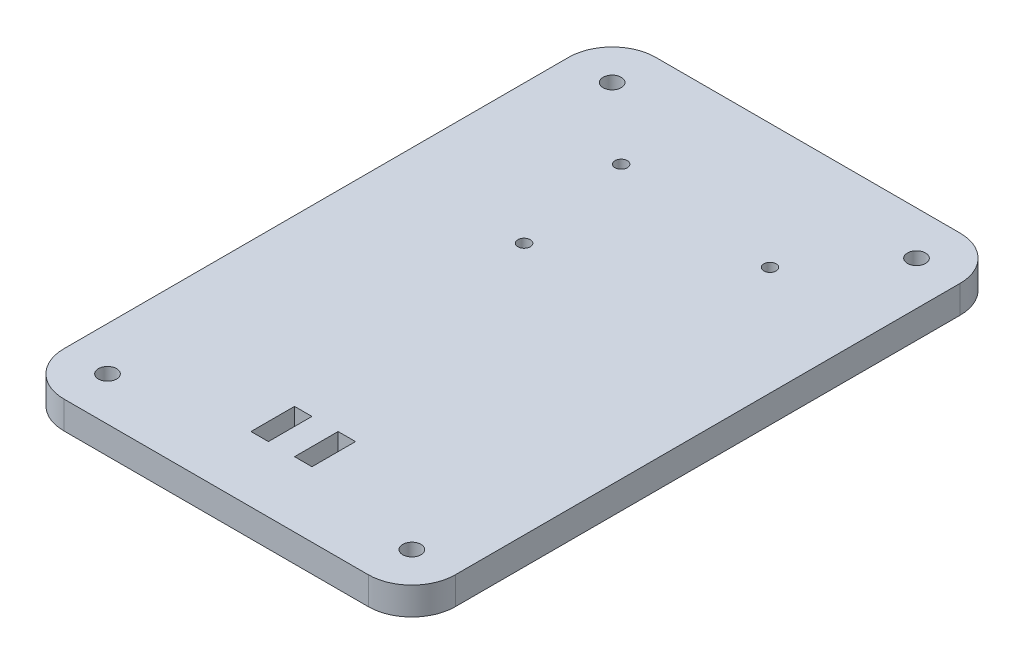
ISO-10303-21;
HEADER;
FILE_DESCRIPTION(('STEP AP214'),'2;1');
FILE_NAME('part.step','',(''),(''),'','','');
FILE_SCHEMA(('AUTOMOTIVE_DESIGN { 1 0 10303 214 1 1 1 1 }'));
ENDSEC;
DATA;
#1=APPLICATION_CONTEXT('core data for automotive mechanical design processes');
#2=APPLICATION_PROTOCOL_DEFINITION('international standard','automotive_design',2000,#1);
#3=PRODUCT_CONTEXT('',#1,'mechanical');
#4=PRODUCT('Part','Part','',(#3));
#5=PRODUCT_RELATED_PRODUCT_CATEGORY('part','',(#4));
#6=PRODUCT_DEFINITION_FORMATION('','',#4);
#7=PRODUCT_DEFINITION_CONTEXT('part definition',#1,'design');
#8=PRODUCT_DEFINITION('design','',#6,#7);
#9=PRODUCT_DEFINITION_SHAPE('','',#8);
#10=(LENGTH_UNIT() NAMED_UNIT(*) SI_UNIT(.MILLI.,.METRE.));
#11=(NAMED_UNIT(*) PLANE_ANGLE_UNIT() SI_UNIT($,.RADIAN.));
#12=(NAMED_UNIT(*) SI_UNIT($,.STERADIAN.) SOLID_ANGLE_UNIT());
#13=UNCERTAINTY_MEASURE_WITH_UNIT(LENGTH_MEASURE(1.E-05),#10,'distance_accuracy_value','');
#14=(GEOMETRIC_REPRESENTATION_CONTEXT(3) GLOBAL_UNCERTAINTY_ASSIGNED_CONTEXT((#13)) GLOBAL_UNIT_ASSIGNED_CONTEXT((#10,
#11,#12)) REPRESENTATION_CONTEXT('',''));
#15=CARTESIAN_POINT('',(0.,0.,0.));
#16=DIRECTION('',(0.,0.,1.));
#17=DIRECTION('',(1.,0.,0.));
#18=AXIS2_PLACEMENT_3D('',#15,#16,#17);
#19=CARTESIAN_POINT('',(34.925,6.35,-57.912));
#20=DIRECTION('',(0.,-1.,0.));
#21=DIRECTION('',(0.,0.,-1.));
#22=AXIS2_PLACEMENT_3D('',#19,#20,#21);
#23=PLANE('',#22);
#24=DIRECTION('',(0.,0.,-1.));
#25=VECTOR('',#24,1.);
#26=CARTESIAN_POINT('',(-3.,6.35,42.912));
#27=LINE('',#26,#25);
#28=CARTESIAN_POINT('',(-3.,6.35,52.912));
#29=VERTEX_POINT('',#28);
#30=CARTESIAN_POINT('',(-3.,6.35,42.912));
#31=VERTEX_POINT('',#30);
#32=EDGE_CURVE('E182',#29,#31,#27,.T.);
#33=ORIENTED_EDGE('',*,*,#32,.F.);
#34=DIRECTION('',(1.,0.,0.));
#35=VECTOR('',#34,1.);
#36=CARTESIAN_POINT('',(-7.,6.35,52.912));
#37=LINE('',#36,#35);
#38=CARTESIAN_POINT('',(-7.,6.35,52.912));
#39=VERTEX_POINT('',#38);
#40=EDGE_CURVE('E190',#39,#29,#37,.T.);
#41=ORIENTED_EDGE('',*,*,#40,.F.);
#42=DIRECTION('',(0.,0.,1.));
#43=VECTOR('',#42,1.);
#44=CARTESIAN_POINT('',(-7.,6.35,42.912));
#45=LINE('',#44,#43);
#46=CARTESIAN_POINT('',(-7.,6.35,42.912));
#47=VERTEX_POINT('',#46);
#48=EDGE_CURVE('E187',#47,#39,#45,.T.);
#49=ORIENTED_EDGE('',*,*,#48,.F.);
#50=DIRECTION('',(-1.,0.,0.));
#51=VECTOR('',#50,1.);
#52=CARTESIAN_POINT('',(-7.,6.35,42.912));
#53=LINE('',#52,#51);
#54=EDGE_CURVE('E184',#31,#47,#53,.T.);
#55=ORIENTED_EDGE('',*,*,#54,.F.);
#56=EDGE_LOOP('',(#33,#41,#49,#55));
#57=FACE_BOUND('',#56,.T.);
#58=CARTESIAN_POINT('',(-13.081,6.35,-15.8572));
#59=DIRECTION('',(0.,1.,0.));
#60=DIRECTION('',(0.,0.,1.));
#61=AXIS2_PLACEMENT_3D('',#58,#59,#60);
#62=CIRCLE('',#61,1.42240000000003);
#63=CARTESIAN_POINT('',(-13.081,6.35,-14.4348));
#64=VERTEX_POINT('',#63);
#65=EDGE_CURVE('E219',#64,#64,#62,.T.);
#66=ORIENTED_EDGE('',*,*,#65,.F.);
#67=EDGE_LOOP('',(#66));
#68=FACE_BOUND('',#67,.T.);
#69=CARTESIAN_POINT('',(-34.925,6.35,57.912));
#70=DIRECTION('',(0.,1.,0.));
#71=DIRECTION('',(0.,0.,1.));
#72=AXIS2_PLACEMENT_3D('',#69,#70,#71);
#73=CIRCLE('',#72,2.0828);
#74=CARTESIAN_POINT('',(-34.925,6.35,59.9948));
#75=VERTEX_POINT('',#74);
#76=EDGE_CURVE('E231',#75,#75,#73,.T.);
#77=ORIENTED_EDGE('',*,*,#76,.F.);
#78=EDGE_LOOP('',(#77));
#79=FACE_BOUND('',#78,.T.);
#80=CARTESIAN_POINT('',(34.925,6.35,-57.912));
#81=DIRECTION('',(0.,1.,0.));
#82=DIRECTION('',(0.,0.,1.));
#83=AXIS2_PLACEMENT_3D('',#80,#81,#82);
#84=CIRCLE('',#83,2.0828);
#85=CARTESIAN_POINT('',(34.925,6.35,-55.8292));
#86=VERTEX_POINT('',#85);
#87=EDGE_CURVE('E243',#86,#86,#84,.T.);
#88=ORIENTED_EDGE('',*,*,#87,.F.);
#89=EDGE_LOOP('',(#88));
#90=FACE_BOUND('',#89,.T.);
#91=CARTESIAN_POINT('',(34.925,6.35,-57.912));
#92=DIRECTION('',(0.,1.,0.));
#93=DIRECTION('',(0.,0.,-1.));
#94=AXIS2_PLACEMENT_3D('',#91,#92,#93);
#95=CIRCLE('',#94,10.);
#96=CARTESIAN_POINT('',(44.925,6.35,-57.912));
#97=VERTEX_POINT('',#96);
#98=CARTESIAN_POINT('',(34.925,6.35,-67.912));
#99=VERTEX_POINT('',#98);
#100=EDGE_CURVE('E255',#97,#99,#95,.T.);
#101=ORIENTED_EDGE('',*,*,#100,.T.);
#102=DIRECTION('',(-1.,0.,0.));
#103=VECTOR('',#102,1.);
#104=CARTESIAN_POINT('',(-34.925,6.35,-67.912));
#105=LINE('',#104,#103);
#106=CARTESIAN_POINT('',(-34.925,6.35,-67.912));
#107=VERTEX_POINT('',#106);
#108=EDGE_CURVE('E258',#99,#107,#105,.T.);
#109=ORIENTED_EDGE('',*,*,#108,.T.);
#110=CARTESIAN_POINT('',(-34.925,6.35,-57.912));
#111=DIRECTION('',(0.,1.,0.));
#112=DIRECTION('',(0.,0.,1.));
#113=AXIS2_PLACEMENT_3D('',#110,#111,#112);
#114=CIRCLE('',#113,10.);
#115=CARTESIAN_POINT('',(-44.925,6.35,-57.912));
#116=VERTEX_POINT('',#115);
#117=EDGE_CURVE('E261',#107,#116,#114,.T.);
#118=ORIENTED_EDGE('',*,*,#117,.T.);
#119=DIRECTION('',(0.,0.,1.));
#120=VECTOR('',#119,1.);
#121=CARTESIAN_POINT('',(-44.925,6.35,57.912));
#122=LINE('',#121,#120);
#123=CARTESIAN_POINT('',(-44.925,6.35,57.912));
#124=VERTEX_POINT('',#123);
#125=EDGE_CURVE('E263',#116,#124,#122,.T.);
#126=ORIENTED_EDGE('',*,*,#125,.T.);
#127=CARTESIAN_POINT('',(-34.925,6.35,57.912));
#128=DIRECTION('',(0.,1.,0.));
#129=DIRECTION('',(0.,0.,-1.));
#130=AXIS2_PLACEMENT_3D('',#127,#128,#129);
#131=CIRCLE('',#130,10.);
#132=CARTESIAN_POINT('',(-34.925,6.35,67.912));
#133=VERTEX_POINT('',#132);
#134=EDGE_CURVE('E265',#124,#133,#131,.T.);
#135=ORIENTED_EDGE('',*,*,#134,.T.);
#136=DIRECTION('',(1.,0.,0.));
#137=VECTOR('',#136,1.);
#138=CARTESIAN_POINT('',(-34.925,6.35,67.912));
#139=LINE('',#138,#137);
#140=CARTESIAN_POINT('',(34.925,6.35,67.912));
#141=VERTEX_POINT('',#140);
#142=EDGE_CURVE('E267',#133,#141,#139,.T.);
#143=ORIENTED_EDGE('',*,*,#142,.T.);
#144=CARTESIAN_POINT('',(34.925,6.35,57.912));
#145=DIRECTION('',(0.,1.,0.));
#146=DIRECTION('',(0.,0.,-1.));
#147=AXIS2_PLACEMENT_3D('',#144,#145,#146);
#148=CIRCLE('',#147,10.);
#149=CARTESIAN_POINT('',(44.925,6.35,57.912));
#150=VERTEX_POINT('',#149);
#151=EDGE_CURVE('E269',#141,#150,#148,.T.);
#152=ORIENTED_EDGE('',*,*,#151,.T.);
#153=DIRECTION('',(0.,0.,-1.));
#154=VECTOR('',#153,1.);
#155=CARTESIAN_POINT('',(44.925,6.35,57.912));
#156=LINE('',#155,#154);
#157=EDGE_CURVE('E271',#150,#97,#156,.T.);
#158=ORIENTED_EDGE('',*,*,#157,.T.);
#159=EDGE_LOOP('',(#101,#109,#118,#126,#135,#143,#152,#158));
#160=FACE_BOUND('',#159,.T.);
#161=CARTESIAN_POINT('',(-34.925,6.35,-57.912));
#162=DIRECTION('',(0.,1.,0.));
#163=DIRECTION('',(0.,0.,1.));
#164=AXIS2_PLACEMENT_3D('',#161,#162,#163);
#165=CIRCLE('',#164,2.0828);
#166=CARTESIAN_POINT('',(-34.925,6.35,-55.8292));
#167=VERTEX_POINT('',#166);
#168=EDGE_CURVE('E249',#167,#167,#165,.T.);
#169=ORIENTED_EDGE('',*,*,#168,.F.);
#170=EDGE_LOOP('',(#169));
#171=FACE_BOUND('',#170,.T.);
#172=CARTESIAN_POINT('',(34.925,6.35,57.912));
#173=DIRECTION('',(0.,1.,0.));
#174=DIRECTION('',(0.,0.,1.));
#175=AXIS2_PLACEMENT_3D('',#172,#173,#174);
#176=CIRCLE('',#175,2.0828);
#177=CARTESIAN_POINT('',(34.925,6.35,59.9948));
#178=VERTEX_POINT('',#177);
#179=EDGE_CURVE('E237',#178,#178,#176,.T.);
#180=ORIENTED_EDGE('',*,*,#179,.F.);
#181=EDGE_LOOP('',(#180));
#182=FACE_BOUND('',#181,.T.);
#183=CARTESIAN_POINT('',(19.939,6.35,-39.276));
#184=DIRECTION('',(0.,1.,0.));
#185=DIRECTION('',(0.,0.,1.));
#186=AXIS2_PLACEMENT_3D('',#183,#184,#185);
#187=CIRCLE('',#186,1.42240000000003);
#188=CARTESIAN_POINT('',(19.939,6.35,-37.8536));
#189=VERTEX_POINT('',#188);
#190=EDGE_CURVE('E225',#189,#189,#187,.T.);
#191=ORIENTED_EDGE('',*,*,#190,.F.);
#192=EDGE_LOOP('',(#191));
#193=FACE_BOUND('',#192,.T.);
#194=CARTESIAN_POINT('',(-17.653,6.35,-42.705));
#195=DIRECTION('',(0.,1.,0.));
#196=DIRECTION('',(0.,0.,1.));
#197=AXIS2_PLACEMENT_3D('',#194,#195,#196);
#198=CIRCLE('',#197,1.42239999999999);
#199=CARTESIAN_POINT('',(-17.653,6.35,-41.2826));
#200=VERTEX_POINT('',#199);
#201=EDGE_CURVE('E213',#200,#200,#198,.T.);
#202=ORIENTED_EDGE('',*,*,#201,.F.);
#203=EDGE_LOOP('',(#202));
#204=FACE_BOUND('',#203,.T.);
#205=DIRECTION('',(0.,0.,-1.));
#206=VECTOR('',#205,1.);
#207=CARTESIAN_POINT('',(7.00000000000001,6.35,52.912));
#208=LINE('',#207,#206);
#209=CARTESIAN_POINT('',(7.00000000000001,6.35,52.912));
#210=VERTEX_POINT('',#209);
#211=CARTESIAN_POINT('',(7.,6.35,42.912));
#212=VERTEX_POINT('',#211);
#213=EDGE_CURVE('E146',#210,#212,#208,.T.);
#214=ORIENTED_EDGE('',*,*,#213,.F.);
#215=DIRECTION('',(1.,0.,0.));
#216=VECTOR('',#215,1.);
#217=CARTESIAN_POINT('',(3.,6.35,52.912));
#218=LINE('',#217,#216);
#219=CARTESIAN_POINT('',(3.,6.35,52.912));
#220=VERTEX_POINT('',#219);
#221=EDGE_CURVE('E168',#220,#210,#218,.T.);
#222=ORIENTED_EDGE('',*,*,#221,.F.);
#223=DIRECTION('',(0.,0.,1.));
#224=VECTOR('',#223,1.);
#225=CARTESIAN_POINT('',(3.,6.35,52.912));
#226=LINE('',#225,#224);
#227=CARTESIAN_POINT('',(3.,6.35,42.912));
#228=VERTEX_POINT('',#227);
#229=EDGE_CURVE('E166',#228,#220,#226,.T.);
#230=ORIENTED_EDGE('',*,*,#229,.F.);
#231=DIRECTION('',(-1.,0.,0.));
#232=VECTOR('',#231,1.);
#233=CARTESIAN_POINT('',(3.,6.35,42.912));
#234=LINE('',#233,#232);
#235=EDGE_CURVE('E154',#212,#228,#234,.T.);
#236=ORIENTED_EDGE('',*,*,#235,.F.);
#237=EDGE_LOOP('',(#214,#222,#230,#236));
#238=FACE_BOUND('',#237,.T.);
#239=ADVANCED_FACE('F33',(#57,#68,#79,#90,#160,#171,#182,#193,#204,#238),#23,.F.);
#240=CARTESIAN_POINT('',(34.925,0.,-57.912));
#241=DIRECTION('',(0.,-1.,0.));
#242=DIRECTION('',(0.,0.,-1.));
#243=AXIS2_PLACEMENT_3D('',#240,#241,#242);
#244=PLANE('',#243);
#245=DIRECTION('',(1.,0.,0.));
#246=VECTOR('',#245,1.);
#247=CARTESIAN_POINT('',(-7.,0.,52.912));
#248=LINE('',#247,#246);
#249=CARTESIAN_POINT('',(-7.,0.,52.912));
#250=VERTEX_POINT('',#249);
#251=CARTESIAN_POINT('',(-3.,0.,52.912));
#252=VERTEX_POINT('',#251);
#253=EDGE_CURVE('E185',#250,#252,#248,.T.);
#254=ORIENTED_EDGE('',*,*,#253,.T.);
#255=DIRECTION('',(0.,0.,-1.));
#256=VECTOR('',#255,1.);
#257=CARTESIAN_POINT('',(-3.,0.,42.912));
#258=LINE('',#257,#256);
#259=CARTESIAN_POINT('',(-3.,0.,42.912));
#260=VERTEX_POINT('',#259);
#261=EDGE_CURVE('E162',#252,#260,#258,.T.);
#262=ORIENTED_EDGE('',*,*,#261,.T.);
#263=DIRECTION('',(-1.,0.,0.));
#264=VECTOR('',#263,1.);
#265=CARTESIAN_POINT('',(-7.,0.,42.912));
#266=LINE('',#265,#264);
#267=CARTESIAN_POINT('',(-7.,0.,42.912));
#268=VERTEX_POINT('',#267);
#269=EDGE_CURVE('E195',#260,#268,#266,.T.);
#270=ORIENTED_EDGE('',*,*,#269,.T.);
#271=DIRECTION('',(0.,0.,1.));
#272=VECTOR('',#271,1.);
#273=CARTESIAN_POINT('',(-7.,0.,42.912));
#274=LINE('',#273,#272);
#275=EDGE_CURVE('E198',#268,#250,#274,.T.);
#276=ORIENTED_EDGE('',*,*,#275,.T.);
#277=EDGE_LOOP('',(#254,#262,#270,#276));
#278=FACE_BOUND('',#277,.T.);
#279=CARTESIAN_POINT('',(-13.081,0.,-15.8572));
#280=DIRECTION('',(0.,1.,0.));
#281=DIRECTION('',(0.,0.,1.));
#282=AXIS2_PLACEMENT_3D('',#279,#280,#281);
#283=CIRCLE('',#282,1.42240000000003);
#284=CARTESIAN_POINT('',(-13.081,0.,-14.4348));
#285=VERTEX_POINT('',#284);
#286=EDGE_CURVE('E216',#285,#285,#283,.T.);
#287=ORIENTED_EDGE('',*,*,#286,.T.);
#288=EDGE_LOOP('',(#287));
#289=FACE_BOUND('',#288,.T.);
#290=CARTESIAN_POINT('',(-34.925,0.,57.912));
#291=DIRECTION('',(0.,1.,0.));
#292=DIRECTION('',(0.,0.,1.));
#293=AXIS2_PLACEMENT_3D('',#290,#291,#292);
#294=CIRCLE('',#293,2.0828);
#295=CARTESIAN_POINT('',(-34.925,0.,59.9948));
#296=VERTEX_POINT('',#295);
#297=EDGE_CURVE('E228',#296,#296,#294,.T.);
#298=ORIENTED_EDGE('',*,*,#297,.T.);
#299=EDGE_LOOP('',(#298));
#300=FACE_BOUND('',#299,.T.);
#301=CARTESIAN_POINT('',(34.925,0.,-57.912));
#302=DIRECTION('',(0.,1.,0.));
#303=DIRECTION('',(0.,0.,1.));
#304=AXIS2_PLACEMENT_3D('',#301,#302,#303);
#305=CIRCLE('',#304,2.0828);
#306=CARTESIAN_POINT('',(34.925,0.,-55.8292));
#307=VERTEX_POINT('',#306);
#308=EDGE_CURVE('E240',#307,#307,#305,.T.);
#309=ORIENTED_EDGE('',*,*,#308,.T.);
#310=EDGE_LOOP('',(#309));
#311=FACE_BOUND('',#310,.T.);
#312=CARTESIAN_POINT('',(34.925,0.,-57.912));
#313=DIRECTION('',(0.,1.,0.));
#314=DIRECTION('',(0.,0.,-1.));
#315=AXIS2_PLACEMENT_3D('',#312,#313,#314);
#316=CIRCLE('',#315,10.);
#317=CARTESIAN_POINT('',(44.925,0.,-57.912));
#318=VERTEX_POINT('',#317);
#319=CARTESIAN_POINT('',(34.925,0.,-67.912));
#320=VERTEX_POINT('',#319);
#321=EDGE_CURVE('E252',#318,#320,#316,.T.);
#322=ORIENTED_EDGE('',*,*,#321,.F.);
#323=DIRECTION('',(0.,0.,-1.));
#324=VECTOR('',#323,1.);
#325=CARTESIAN_POINT('',(44.925,0.,57.912));
#326=LINE('',#325,#324);
#327=CARTESIAN_POINT('',(44.925,0.,57.912));
#328=VERTEX_POINT('',#327);
#329=EDGE_CURVE('E259',#328,#318,#326,.T.);
#330=ORIENTED_EDGE('',*,*,#329,.F.);
#331=CARTESIAN_POINT('',(34.925,0.,57.912));
#332=DIRECTION('',(0.,1.,0.));
#333=DIRECTION('',(0.,0.,-1.));
#334=AXIS2_PLACEMENT_3D('',#331,#332,#333);
#335=CIRCLE('',#334,10.);
#336=CARTESIAN_POINT('',(34.925,0.,67.912));
#337=VERTEX_POINT('',#336);
#338=EDGE_CURVE('E286',#337,#328,#335,.T.);
#339=ORIENTED_EDGE('',*,*,#338,.F.);
#340=DIRECTION('',(1.,0.,0.));
#341=VECTOR('',#340,1.);
#342=CARTESIAN_POINT('',(-34.925,0.,67.912));
#343=LINE('',#342,#341);
#344=CARTESIAN_POINT('',(-34.925,0.,67.912));
#345=VERTEX_POINT('',#344);
#346=EDGE_CURVE('E284',#345,#337,#343,.T.);
#347=ORIENTED_EDGE('',*,*,#346,.F.);
#348=CARTESIAN_POINT('',(-34.925,0.,57.912));
#349=DIRECTION('',(0.,1.,0.));
#350=DIRECTION('',(0.,0.,-1.));
#351=AXIS2_PLACEMENT_3D('',#348,#349,#350);
#352=CIRCLE('',#351,10.);
#353=CARTESIAN_POINT('',(-44.925,0.,57.912));
#354=VERTEX_POINT('',#353);
#355=EDGE_CURVE('E282',#354,#345,#352,.T.);
#356=ORIENTED_EDGE('',*,*,#355,.F.);
#357=DIRECTION('',(0.,0.,1.));
#358=VECTOR('',#357,1.);
#359=CARTESIAN_POINT('',(-44.925,0.,57.912));
#360=LINE('',#359,#358);
#361=CARTESIAN_POINT('',(-44.925,0.,-57.912));
#362=VERTEX_POINT('',#361);
#363=EDGE_CURVE('E280',#362,#354,#360,.T.);
#364=ORIENTED_EDGE('',*,*,#363,.F.);
#365=CARTESIAN_POINT('',(-34.925,0.,-57.912));
#366=DIRECTION('',(0.,1.,0.));
#367=DIRECTION('',(0.,0.,1.));
#368=AXIS2_PLACEMENT_3D('',#365,#366,#367);
#369=CIRCLE('',#368,10.);
#370=CARTESIAN_POINT('',(-34.925,0.,-67.912));
#371=VERTEX_POINT('',#370);
#372=EDGE_CURVE('E278',#371,#362,#369,.T.);
#373=ORIENTED_EDGE('',*,*,#372,.F.);
#374=DIRECTION('',(-1.,0.,0.));
#375=VECTOR('',#374,1.);
#376=CARTESIAN_POINT('',(-34.925,0.,-67.912));
#377=LINE('',#376,#375);
#378=EDGE_CURVE('E276',#320,#371,#377,.T.);
#379=ORIENTED_EDGE('',*,*,#378,.F.);
#380=EDGE_LOOP('',(#322,#330,#339,#347,#356,#364,#373,#379));
#381=FACE_BOUND('',#380,.T.);
#382=CARTESIAN_POINT('',(-34.925,0.,-57.912));
#383=DIRECTION('',(0.,1.,0.));
#384=DIRECTION('',(0.,0.,1.));
#385=AXIS2_PLACEMENT_3D('',#382,#383,#384);
#386=CIRCLE('',#385,2.0828);
#387=CARTESIAN_POINT('',(-34.925,0.,-55.8292));
#388=VERTEX_POINT('',#387);
#389=EDGE_CURVE('E246',#388,#388,#386,.T.);
#390=ORIENTED_EDGE('',*,*,#389,.T.);
#391=EDGE_LOOP('',(#390));
#392=FACE_BOUND('',#391,.T.);
#393=CARTESIAN_POINT('',(34.925,0.,57.912));
#394=DIRECTION('',(0.,1.,0.));
#395=DIRECTION('',(0.,0.,1.));
#396=AXIS2_PLACEMENT_3D('',#393,#394,#395);
#397=CIRCLE('',#396,2.0828);
#398=CARTESIAN_POINT('',(34.925,0.,59.9948));
#399=VERTEX_POINT('',#398);
#400=EDGE_CURVE('E234',#399,#399,#397,.T.);
#401=ORIENTED_EDGE('',*,*,#400,.T.);
#402=EDGE_LOOP('',(#401));
#403=FACE_BOUND('',#402,.T.);
#404=CARTESIAN_POINT('',(19.939,0.,-39.276));
#405=DIRECTION('',(0.,1.,0.));
#406=DIRECTION('',(0.,0.,1.));
#407=AXIS2_PLACEMENT_3D('',#404,#405,#406);
#408=CIRCLE('',#407,1.42240000000003);
#409=CARTESIAN_POINT('',(19.939,0.,-37.8536));
#410=VERTEX_POINT('',#409);
#411=EDGE_CURVE('E222',#410,#410,#408,.T.);
#412=ORIENTED_EDGE('',*,*,#411,.T.);
#413=EDGE_LOOP('',(#412));
#414=FACE_BOUND('',#413,.T.);
#415=CARTESIAN_POINT('',(-17.653,0.,-42.705));
#416=DIRECTION('',(0.,1.,0.));
#417=DIRECTION('',(0.,0.,1.));
#418=AXIS2_PLACEMENT_3D('',#415,#416,#417);
#419=CIRCLE('',#418,1.42239999999999);
#420=CARTESIAN_POINT('',(-17.653,0.,-41.2826));
#421=VERTEX_POINT('',#420);
#422=EDGE_CURVE('E212',#421,#421,#419,.T.);
#423=ORIENTED_EDGE('',*,*,#422,.T.);
#424=EDGE_LOOP('',(#423));
#425=FACE_BOUND('',#424,.T.);
#426=DIRECTION('',(1.,0.,0.));
#427=VECTOR('',#426,1.);
#428=CARTESIAN_POINT('',(3.,0.,52.912));
#429=LINE('',#428,#427);
#430=CARTESIAN_POINT('',(3.,0.,52.912));
#431=VERTEX_POINT('',#430);
#432=CARTESIAN_POINT('',(7.,0.,52.912));
#433=VERTEX_POINT('',#432);
#434=EDGE_CURVE('E155',#431,#433,#429,.T.);
#435=ORIENTED_EDGE('',*,*,#434,.T.);
#436=DIRECTION('',(0.,0.,-1.));
#437=VECTOR('',#436,1.);
#438=CARTESIAN_POINT('',(7.00000000000001,0.,52.912));
#439=LINE('',#438,#437);
#440=CARTESIAN_POINT('',(7.,0.,42.912));
#441=VERTEX_POINT('',#440);
#442=EDGE_CURVE('E56',#433,#441,#439,.T.);
#443=ORIENTED_EDGE('',*,*,#442,.T.);
#444=DIRECTION('',(-1.,0.,0.));
#445=VECTOR('',#444,1.);
#446=CARTESIAN_POINT('',(3.,0.,42.912));
#447=LINE('',#446,#445);
#448=CARTESIAN_POINT('',(3.,0.,42.912));
#449=VERTEX_POINT('',#448);
#450=EDGE_CURVE('E161',#441,#449,#447,.T.);
#451=ORIENTED_EDGE('',*,*,#450,.T.);
#452=DIRECTION('',(0.,0.,1.));
#453=VECTOR('',#452,1.);
#454=CARTESIAN_POINT('',(3.,0.,52.912));
#455=LINE('',#454,#453);
#456=EDGE_CURVE('E174',#449,#431,#455,.T.);
#457=ORIENTED_EDGE('',*,*,#456,.T.);
#458=EDGE_LOOP('',(#435,#443,#451,#457));
#459=FACE_BOUND('',#458,.T.);
#460=ADVANCED_FACE('F316',(#278,#289,#300,#311,#381,#392,#403,#414,#425,#459),#244,.T.);
#461=CARTESIAN_POINT('',(34.925,6.35,-57.912));
#462=DIRECTION('',(0.,-1.,0.));
#463=DIRECTION('',(0.,0.,-1.));
#464=AXIS2_PLACEMENT_3D('',#461,#462,#463);
#465=CYLINDRICAL_SURFACE('',#464,10.);
#466=ORIENTED_EDGE('',*,*,#321,.T.);
#467=DIRECTION('',(0.,-1.,0.));
#468=VECTOR('',#467,1.);
#469=CARTESIAN_POINT('',(34.925,6.35,-67.912));
#470=LINE('',#469,#468);
#471=EDGE_CURVE('E11',#99,#320,#470,.T.);
#472=ORIENTED_EDGE('',*,*,#471,.F.);
#473=ORIENTED_EDGE('',*,*,#100,.F.);
#474=DIRECTION('',(0.,-1.,0.));
#475=VECTOR('',#474,1.);
#476=CARTESIAN_POINT('',(44.925,6.35,-57.912));
#477=LINE('',#476,#475);
#478=EDGE_CURVE('E273',#97,#318,#477,.T.);
#479=ORIENTED_EDGE('',*,*,#478,.T.);
#480=EDGE_LOOP('',(#466,#472,#473,#479));
#481=FACE_BOUND('',#480,.T.);
#482=ADVANCED_FACE('F35',(#481),#465,.T.);
#483=CARTESIAN_POINT('',(-34.925,6.35,-67.912));
#484=DIRECTION('',(0.,0.,1.));
#485=DIRECTION('',(1.,0.,0.));
#486=AXIS2_PLACEMENT_3D('',#483,#484,#485);
#487=PLANE('',#486);
#488=ORIENTED_EDGE('',*,*,#378,.T.);
#489=DIRECTION('',(0.,-1.,0.));
#490=VECTOR('',#489,1.);
#491=CARTESIAN_POINT('',(-34.925,6.35,-67.912));
#492=LINE('',#491,#490);
#493=EDGE_CURVE('E41',#107,#371,#492,.T.);
#494=ORIENTED_EDGE('',*,*,#493,.F.);
#495=ORIENTED_EDGE('',*,*,#108,.F.);
#496=ORIENTED_EDGE('',*,*,#471,.T.);
#497=EDGE_LOOP('',(#488,#494,#495,#496));
#498=FACE_BOUND('',#497,.T.);
#499=ADVANCED_FACE('F334',(#498),#487,.F.);
#500=CARTESIAN_POINT('',(-34.925,6.35,-57.912));
#501=DIRECTION('',(0.,-1.,0.));
#502=DIRECTION('',(0.,0.,-1.));
#503=AXIS2_PLACEMENT_3D('',#500,#501,#502);
#504=CYLINDRICAL_SURFACE('',#503,10.);
#505=ORIENTED_EDGE('',*,*,#372,.T.);
#506=DIRECTION('',(0.,-1.,0.));
#507=VECTOR('',#506,1.);
#508=CARTESIAN_POINT('',(-44.925,6.35,-57.912));
#509=LINE('',#508,#507);
#510=EDGE_CURVE('E303',#116,#362,#509,.T.);
#511=ORIENTED_EDGE('',*,*,#510,.F.);
#512=ORIENTED_EDGE('',*,*,#117,.F.);
#513=ORIENTED_EDGE('',*,*,#493,.T.);
#514=EDGE_LOOP('',(#505,#511,#512,#513));
#515=FACE_BOUND('',#514,.T.);
#516=ADVANCED_FACE('F310',(#515),#504,.T.);
#517=CARTESIAN_POINT('',(-44.925,6.35,57.912));
#518=DIRECTION('',(1.,0.,0.));
#519=DIRECTION('',(0.,0.,-1.));
#520=AXIS2_PLACEMENT_3D('',#517,#518,#519);
#521=PLANE('',#520);
#522=ORIENTED_EDGE('',*,*,#363,.T.);
#523=DIRECTION('',(0.,-1.,0.));
#524=VECTOR('',#523,1.);
#525=CARTESIAN_POINT('',(-44.925,6.35,57.912));
#526=LINE('',#525,#524);
#527=EDGE_CURVE('E300',#124,#354,#526,.T.);
#528=ORIENTED_EDGE('',*,*,#527,.F.);
#529=ORIENTED_EDGE('',*,*,#125,.F.);
#530=ORIENTED_EDGE('',*,*,#510,.T.);
#531=EDGE_LOOP('',(#522,#528,#529,#530));
#532=FACE_BOUND('',#531,.T.);
#533=ADVANCED_FACE('F322',(#532),#521,.F.);
#534=CARTESIAN_POINT('',(-34.925,6.35,57.912));
#535=DIRECTION('',(0.,-1.,0.));
#536=DIRECTION('',(0.,0.,-1.));
#537=AXIS2_PLACEMENT_3D('',#534,#535,#536);
#538=CYLINDRICAL_SURFACE('',#537,10.);
#539=ORIENTED_EDGE('',*,*,#355,.T.);
#540=DIRECTION('',(0.,-1.,0.));
#541=VECTOR('',#540,1.);
#542=CARTESIAN_POINT('',(-34.925,6.35,67.912));
#543=LINE('',#542,#541);
#544=EDGE_CURVE('E297',#133,#345,#543,.T.);
#545=ORIENTED_EDGE('',*,*,#544,.F.);
#546=ORIENTED_EDGE('',*,*,#134,.F.);
#547=ORIENTED_EDGE('',*,*,#527,.T.);
#548=EDGE_LOOP('',(#539,#545,#546,#547));
#549=FACE_BOUND('',#548,.T.);
#550=ADVANCED_FACE('F326',(#549),#538,.T.);
#551=CARTESIAN_POINT('',(-34.925,6.35,67.912));
#552=DIRECTION('',(0.,0.,-1.));
#553=DIRECTION('',(-1.,0.,0.));
#554=AXIS2_PLACEMENT_3D('',#551,#552,#553);
#555=PLANE('',#554);
#556=ORIENTED_EDGE('',*,*,#346,.T.);
#557=DIRECTION('',(0.,-1.,0.));
#558=VECTOR('',#557,1.);
#559=CARTESIAN_POINT('',(34.925,6.35,67.912));
#560=LINE('',#559,#558);
#561=EDGE_CURVE('E294',#141,#337,#560,.T.);
#562=ORIENTED_EDGE('',*,*,#561,.F.);
#563=ORIENTED_EDGE('',*,*,#142,.F.);
#564=ORIENTED_EDGE('',*,*,#544,.T.);
#565=EDGE_LOOP('',(#556,#562,#563,#564));
#566=FACE_BOUND('',#565,.T.);
#567=ADVANCED_FACE('F347',(#566),#555,.F.);
#568=CARTESIAN_POINT('',(34.925,6.35,57.912));
#569=DIRECTION('',(0.,-1.,0.));
#570=DIRECTION('',(0.,0.,-1.));
#571=AXIS2_PLACEMENT_3D('',#568,#569,#570);
#572=CYLINDRICAL_SURFACE('',#571,10.);
#573=ORIENTED_EDGE('',*,*,#338,.T.);
#574=DIRECTION('',(0.,-1.,0.));
#575=VECTOR('',#574,1.);
#576=CARTESIAN_POINT('',(44.925,6.35,57.912));
#577=LINE('',#576,#575);
#578=EDGE_CURVE('E291',#150,#328,#577,.T.);
#579=ORIENTED_EDGE('',*,*,#578,.F.);
#580=ORIENTED_EDGE('',*,*,#151,.F.);
#581=ORIENTED_EDGE('',*,*,#561,.T.);
#582=EDGE_LOOP('',(#573,#579,#580,#581));
#583=FACE_BOUND('',#582,.T.);
#584=ADVANCED_FACE('F345',(#583),#572,.T.);
#585=CARTESIAN_POINT('',(44.925,6.35,57.912));
#586=DIRECTION('',(-1.,0.,0.));
#587=DIRECTION('',(0.,0.,1.));
#588=AXIS2_PLACEMENT_3D('',#585,#586,#587);
#589=PLANE('',#588);
#590=ORIENTED_EDGE('',*,*,#329,.T.);
#591=ORIENTED_EDGE('',*,*,#478,.F.);
#592=ORIENTED_EDGE('',*,*,#157,.F.);
#593=ORIENTED_EDGE('',*,*,#578,.T.);
#594=EDGE_LOOP('',(#590,#591,#592,#593));
#595=FACE_BOUND('',#594,.T.);
#596=ADVANCED_FACE('F340',(#595),#589,.F.);
#597=CARTESIAN_POINT('',(-34.925,6.35,-57.912));
#598=DIRECTION('',(0.,-1.,0.));
#599=DIRECTION('',(0.,0.,-1.));
#600=AXIS2_PLACEMENT_3D('',#597,#598,#599);
#601=CYLINDRICAL_SURFACE('',#600,2.0828);
#602=ORIENTED_EDGE('',*,*,#168,.T.);
#603=EDGE_LOOP('',(#602));
#604=FACE_BOUND('',#603,.T.);
#605=ORIENTED_EDGE('',*,*,#389,.F.);
#606=EDGE_LOOP('',(#605));
#607=FACE_BOUND('',#606,.T.);
#608=ADVANCED_FACE('F367',(#604,#607),#601,.F.);
#609=CARTESIAN_POINT('',(34.925,6.35,-57.912));
#610=DIRECTION('',(0.,-1.,0.));
#611=DIRECTION('',(0.,0.,-1.));
#612=AXIS2_PLACEMENT_3D('',#609,#610,#611);
#613=CYLINDRICAL_SURFACE('',#612,2.0828);
#614=ORIENTED_EDGE('',*,*,#87,.T.);
#615=EDGE_LOOP('',(#614));
#616=FACE_BOUND('',#615,.T.);
#617=ORIENTED_EDGE('',*,*,#308,.F.);
#618=EDGE_LOOP('',(#617));
#619=FACE_BOUND('',#618,.T.);
#620=ADVANCED_FACE('F374',(#616,#619),#613,.F.);
#621=CARTESIAN_POINT('',(34.925,6.35,57.912));
#622=DIRECTION('',(0.,-1.,0.));
#623=DIRECTION('',(0.,0.,-1.));
#624=AXIS2_PLACEMENT_3D('',#621,#622,#623);
#625=CYLINDRICAL_SURFACE('',#624,2.0828);
#626=ORIENTED_EDGE('',*,*,#179,.T.);
#627=EDGE_LOOP('',(#626));
#628=FACE_BOUND('',#627,.T.);
#629=ORIENTED_EDGE('',*,*,#400,.F.);
#630=EDGE_LOOP('',(#629));
#631=FACE_BOUND('',#630,.T.);
#632=ADVANCED_FACE('F379',(#628,#631),#625,.F.);
#633=CARTESIAN_POINT('',(-34.925,6.35,57.912));
#634=DIRECTION('',(0.,-1.,0.));
#635=DIRECTION('',(0.,0.,-1.));
#636=AXIS2_PLACEMENT_3D('',#633,#634,#635);
#637=CYLINDRICAL_SURFACE('',#636,2.0828);
#638=ORIENTED_EDGE('',*,*,#76,.T.);
#639=EDGE_LOOP('',(#638));
#640=FACE_BOUND('',#639,.T.);
#641=ORIENTED_EDGE('',*,*,#297,.F.);
#642=EDGE_LOOP('',(#641));
#643=FACE_BOUND('',#642,.T.);
#644=ADVANCED_FACE('F433',(#640,#643),#637,.F.);
#645=CARTESIAN_POINT('',(19.939,6.35,-39.276));
#646=DIRECTION('',(0.,-1.,0.));
#647=DIRECTION('',(0.,0.,-1.));
#648=AXIS2_PLACEMENT_3D('',#645,#646,#647);
#649=CYLINDRICAL_SURFACE('',#648,1.42240000000003);
#650=ORIENTED_EDGE('',*,*,#190,.T.);
#651=EDGE_LOOP('',(#650));
#652=FACE_BOUND('',#651,.T.);
#653=ORIENTED_EDGE('',*,*,#411,.F.);
#654=EDGE_LOOP('',(#653));
#655=FACE_BOUND('',#654,.T.);
#656=ADVANCED_FACE('F429',(#652,#655),#649,.F.);
#657=CARTESIAN_POINT('',(-13.081,6.35,-15.8572));
#658=DIRECTION('',(0.,-1.,0.));
#659=DIRECTION('',(0.,0.,-1.));
#660=AXIS2_PLACEMENT_3D('',#657,#658,#659);
#661=CYLINDRICAL_SURFACE('',#660,1.42240000000003);
#662=ORIENTED_EDGE('',*,*,#65,.T.);
#663=EDGE_LOOP('',(#662));
#664=FACE_BOUND('',#663,.T.);
#665=ORIENTED_EDGE('',*,*,#286,.F.);
#666=EDGE_LOOP('',(#665));
#667=FACE_BOUND('',#666,.T.);
#668=ADVANCED_FACE('F425',(#664,#667),#661,.F.);
#669=CARTESIAN_POINT('',(-17.653,6.35,-42.705));
#670=DIRECTION('',(0.,-1.,0.));
#671=DIRECTION('',(0.,0.,-1.));
#672=AXIS2_PLACEMENT_3D('',#669,#670,#671);
#673=CYLINDRICAL_SURFACE('',#672,1.42239999999999);
#674=ORIENTED_EDGE('',*,*,#201,.T.);
#675=EDGE_LOOP('',(#674));
#676=FACE_BOUND('',#675,.T.);
#677=ORIENTED_EDGE('',*,*,#422,.F.);
#678=EDGE_LOOP('',(#677));
#679=FACE_BOUND('',#678,.T.);
#680=ADVANCED_FACE('F421',(#676,#679),#673,.F.);
#681=CARTESIAN_POINT('',(-3.,6.35,42.912));
#682=DIRECTION('',(-1.,0.,0.));
#683=DIRECTION('',(0.,0.,1.));
#684=AXIS2_PLACEMENT_3D('',#681,#682,#683);
#685=PLANE('',#684);
#686=ORIENTED_EDGE('',*,*,#261,.F.);
#687=DIRECTION('',(0.,-1.,0.));
#688=VECTOR('',#687,1.);
#689=CARTESIAN_POINT('',(-3.,6.35,52.912));
#690=LINE('',#689,#688);
#691=EDGE_CURVE('E192',#29,#252,#690,.T.);
#692=ORIENTED_EDGE('',*,*,#691,.F.);
#693=ORIENTED_EDGE('',*,*,#32,.T.);
#694=DIRECTION('',(0.,-1.,0.));
#695=VECTOR('',#694,1.);
#696=CARTESIAN_POINT('',(-3.,6.35,42.912));
#697=LINE('',#696,#695);
#698=EDGE_CURVE('E209',#31,#260,#697,.T.);
#699=ORIENTED_EDGE('',*,*,#698,.T.);
#700=EDGE_LOOP('',(#686,#692,#693,#699));
#701=FACE_BOUND('',#700,.T.);
#702=ADVANCED_FACE('F417',(#701),#685,.T.);
#703=CARTESIAN_POINT('',(-7.,6.35,42.912));
#704=DIRECTION('',(0.,0.,1.));
#705=DIRECTION('',(1.,0.,0.));
#706=AXIS2_PLACEMENT_3D('',#703,#704,#705);
#707=PLANE('',#706);
#708=ORIENTED_EDGE('',*,*,#269,.F.);
#709=ORIENTED_EDGE('',*,*,#698,.F.);
#710=ORIENTED_EDGE('',*,*,#54,.T.);
#711=DIRECTION('',(0.,-1.,0.));
#712=VECTOR('',#711,1.);
#713=CARTESIAN_POINT('',(-7.,6.35,42.912));
#714=LINE('',#713,#712);
#715=EDGE_CURVE('E207',#47,#268,#714,.T.);
#716=ORIENTED_EDGE('',*,*,#715,.T.);
#717=EDGE_LOOP('',(#708,#709,#710,#716));
#718=FACE_BOUND('',#717,.T.);
#719=ADVANCED_FACE('F413',(#718),#707,.T.);
#720=CARTESIAN_POINT('',(-7.,6.35,42.912));
#721=DIRECTION('',(1.,0.,0.));
#722=DIRECTION('',(0.,0.,-1.));
#723=AXIS2_PLACEMENT_3D('',#720,#721,#722);
#724=PLANE('',#723);
#725=ORIENTED_EDGE('',*,*,#275,.F.);
#726=ORIENTED_EDGE('',*,*,#715,.F.);
#727=ORIENTED_EDGE('',*,*,#48,.T.);
#728=DIRECTION('',(0.,-1.,0.));
#729=VECTOR('',#728,1.);
#730=CARTESIAN_POINT('',(-7.,6.35,52.912));
#731=LINE('',#730,#729);
#732=EDGE_CURVE('E205',#39,#250,#731,.T.);
#733=ORIENTED_EDGE('',*,*,#732,.T.);
#734=EDGE_LOOP('',(#725,#726,#727,#733));
#735=FACE_BOUND('',#734,.T.);
#736=ADVANCED_FACE('F409',(#735),#724,.T.);
#737=CARTESIAN_POINT('',(-7.,6.35,52.912));
#738=DIRECTION('',(0.,0.,-1.));
#739=DIRECTION('',(-1.,0.,0.));
#740=AXIS2_PLACEMENT_3D('',#737,#738,#739);
#741=PLANE('',#740);
#742=ORIENTED_EDGE('',*,*,#253,.F.);
#743=ORIENTED_EDGE('',*,*,#732,.F.);
#744=ORIENTED_EDGE('',*,*,#40,.T.);
#745=ORIENTED_EDGE('',*,*,#691,.T.);
#746=EDGE_LOOP('',(#742,#743,#744,#745));
#747=FACE_BOUND('',#746,.T.);
#748=ADVANCED_FACE('F406',(#747),#741,.T.);
#749=CARTESIAN_POINT('',(7.00000000000001,6.35,52.912));
#750=DIRECTION('',(-1.,0.,0.));
#751=DIRECTION('',(0.,0.,1.));
#752=AXIS2_PLACEMENT_3D('',#749,#750,#751);
#753=PLANE('',#752);
#754=ORIENTED_EDGE('',*,*,#442,.F.);
#755=DIRECTION('',(0.,-1.,0.));
#756=VECTOR('',#755,1.);
#757=CARTESIAN_POINT('',(7.00000000000001,6.35,52.912));
#758=LINE('',#757,#756);
#759=EDGE_CURVE('E150',#210,#433,#758,.T.);
#760=ORIENTED_EDGE('',*,*,#759,.F.);
#761=ORIENTED_EDGE('',*,*,#213,.T.);
#762=DIRECTION('',(0.,-1.,0.));
#763=VECTOR('',#762,1.);
#764=CARTESIAN_POINT('',(7.,6.35,42.912));
#765=LINE('',#764,#763);
#766=EDGE_CURVE('E149',#212,#441,#765,.T.);
#767=ORIENTED_EDGE('',*,*,#766,.T.);
#768=EDGE_LOOP('',(#754,#760,#761,#767));
#769=FACE_BOUND('',#768,.T.);
#770=ADVANCED_FACE('F148',(#769),#753,.T.);
#771=CARTESIAN_POINT('',(3.,6.35,42.912));
#772=DIRECTION('',(0.,0.,1.));
#773=DIRECTION('',(1.,0.,0.));
#774=AXIS2_PLACEMENT_3D('',#771,#772,#773);
#775=PLANE('',#774);
#776=ORIENTED_EDGE('',*,*,#450,.F.);
#777=ORIENTED_EDGE('',*,*,#766,.F.);
#778=ORIENTED_EDGE('',*,*,#235,.T.);
#779=DIRECTION('',(0.,-1.,0.));
#780=VECTOR('',#779,1.);
#781=CARTESIAN_POINT('',(3.,6.35,42.912));
#782=LINE('',#781,#780);
#783=EDGE_CURVE('E163',#228,#449,#782,.T.);
#784=ORIENTED_EDGE('',*,*,#783,.T.);
#785=EDGE_LOOP('',(#776,#777,#778,#784));
#786=FACE_BOUND('',#785,.T.);
#787=ADVANCED_FACE('F158',(#786),#775,.T.);
#788=CARTESIAN_POINT('',(3.,6.35,52.912));
#789=DIRECTION('',(1.,0.,0.));
#790=DIRECTION('',(0.,0.,-1.));
#791=AXIS2_PLACEMENT_3D('',#788,#789,#790);
#792=PLANE('',#791);
#793=ORIENTED_EDGE('',*,*,#456,.F.);
#794=ORIENTED_EDGE('',*,*,#783,.F.);
#795=ORIENTED_EDGE('',*,*,#229,.T.);
#796=DIRECTION('',(0.,-1.,0.));
#797=VECTOR('',#796,1.);
#798=CARTESIAN_POINT('',(3.,6.35,52.912));
#799=LINE('',#798,#797);
#800=EDGE_CURVE('E48',#220,#431,#799,.T.);
#801=ORIENTED_EDGE('',*,*,#800,.T.);
#802=EDGE_LOOP('',(#793,#794,#795,#801));
#803=FACE_BOUND('',#802,.T.);
#804=ADVANCED_FACE('F394',(#803),#792,.T.);
#805=CARTESIAN_POINT('',(3.,6.35,52.912));
#806=DIRECTION('',(0.,0.,-1.));
#807=DIRECTION('',(-1.,0.,0.));
#808=AXIS2_PLACEMENT_3D('',#805,#806,#807);
#809=PLANE('',#808);
#810=ORIENTED_EDGE('',*,*,#434,.F.);
#811=ORIENTED_EDGE('',*,*,#800,.F.);
#812=ORIENTED_EDGE('',*,*,#221,.T.);
#813=ORIENTED_EDGE('',*,*,#759,.T.);
#814=EDGE_LOOP('',(#810,#811,#812,#813));
#815=FACE_BOUND('',#814,.T.);
#816=ADVANCED_FACE('F392',(#815),#809,.T.);
#817=CLOSED_SHELL('',(#239,#460,#482,#499,#516,#533,#550,#567,#584,#596,#608,#620,#632,#644,
#656,#668,#680,#702,#719,#736,#748,#770,#787,#804,#816));
#818=MANIFOLD_SOLID_BREP('B2',#817);
#819=ADVANCED_BREP_SHAPE_REPRESENTATION('',(#18,#818),#14);
#820=SHAPE_DEFINITION_REPRESENTATION(#9,#819);
ENDSEC;
END-ISO-10303-21;
